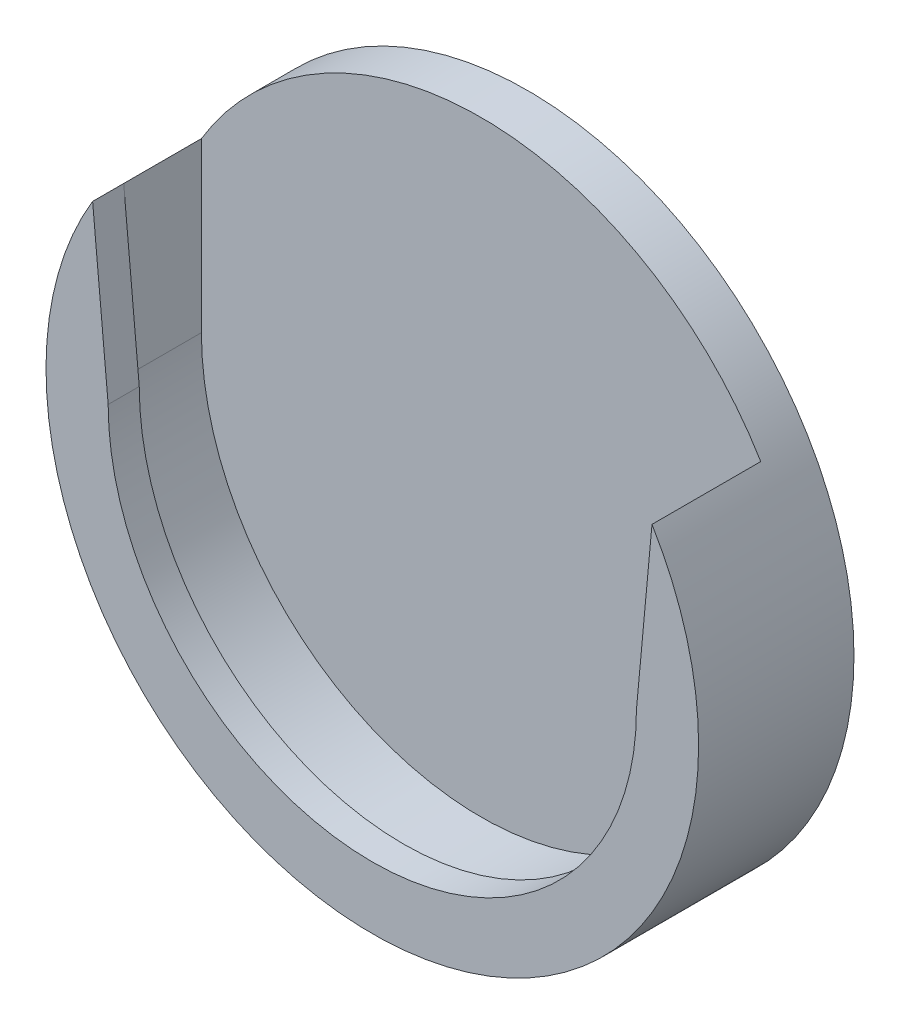
ISO-10303-21;
HEADER;
FILE_DESCRIPTION(('STEP AP214'),'2;1');
FILE_NAME('part.step','',(''),(''),'','','');
FILE_SCHEMA(('AUTOMOTIVE_DESIGN { 1 0 10303 214 1 1 1 1 }'));
ENDSEC;
DATA;
#1=APPLICATION_CONTEXT('core data for automotive mechanical design processes');
#2=APPLICATION_PROTOCOL_DEFINITION('international standard','automotive_design',2000,#1);
#3=PRODUCT_CONTEXT('',#1,'mechanical');
#4=PRODUCT('Part','Part','',(#3));
#5=PRODUCT_RELATED_PRODUCT_CATEGORY('part','',(#4));
#6=PRODUCT_DEFINITION_FORMATION('','',#4);
#7=PRODUCT_DEFINITION_CONTEXT('part definition',#1,'design');
#8=PRODUCT_DEFINITION('design','',#6,#7);
#9=PRODUCT_DEFINITION_SHAPE('','',#8);
#10=(LENGTH_UNIT() NAMED_UNIT(*) SI_UNIT(.MILLI.,.METRE.));
#11=(NAMED_UNIT(*) PLANE_ANGLE_UNIT() SI_UNIT($,.RADIAN.));
#12=(NAMED_UNIT(*) SI_UNIT($,.STERADIAN.) SOLID_ANGLE_UNIT());
#13=UNCERTAINTY_MEASURE_WITH_UNIT(LENGTH_MEASURE(1.E-05),#10,'distance_accuracy_value','');
#14=(GEOMETRIC_REPRESENTATION_CONTEXT(3) GLOBAL_UNCERTAINTY_ASSIGNED_CONTEXT((#13)) GLOBAL_UNIT_ASSIGNED_CONTEXT((#10,
#11,#12)) REPRESENTATION_CONTEXT('',''));
#15=CARTESIAN_POINT('',(0.,0.,0.));
#16=DIRECTION('',(0.,0.,1.));
#17=DIRECTION('',(1.,0.,0.));
#18=AXIS2_PLACEMENT_3D('',#15,#16,#17);
#19=CARTESIAN_POINT('',(0.,0.,-3.));
#20=DIRECTION('',(0.,0.,1.));
#21=DIRECTION('',(1.,0.,0.));
#22=AXIS2_PLACEMENT_3D('',#19,#20,#21);
#23=CYLINDRICAL_SURFACE('',#22,21.);
#24=CARTESIAN_POINT('',(0.,0.,-3.));
#25=DIRECTION('',(0.,0.,1.));
#26=DIRECTION('',(1.,0.,0.));
#27=AXIS2_PLACEMENT_3D('',#24,#25,#26);
#28=CIRCLE('',#27,21.);
#29=CARTESIAN_POINT('',(21.,0.,-3.));
#30=VERTEX_POINT('',#29);
#31=EDGE_CURVE('E11',#30,#30,#28,.T.);
#32=ORIENTED_EDGE('',*,*,#31,.T.);
#33=EDGE_LOOP('',(#32));
#34=FACE_BOUND('',#33,.T.);
#35=CARTESIAN_POINT('',(0.,0.,0.));
#36=DIRECTION('',(0.,0.,1.));
#37=DIRECTION('',(1.,0.,0.));
#38=AXIS2_PLACEMENT_3D('',#35,#36,#37);
#39=CIRCLE('',#38,21.);
#40=CARTESIAN_POINT('',(18.,10.816653826392,0.));
#41=VERTEX_POINT('',#40);
#42=CARTESIAN_POINT('',(-18.,10.816653826392,0.));
#43=VERTEX_POINT('',#42);
#44=EDGE_CURVE('E42',#41,#43,#39,.T.);
#45=ORIENTED_EDGE('',*,*,#44,.F.);
#46=DIRECTION('',(0.,0.,-1.));
#47=VECTOR('',#46,1.);
#48=CARTESIAN_POINT('',(18.,10.816653826392,5.));
#49=LINE('',#48,#47);
#50=CARTESIAN_POINT('',(18.,10.816653826392,5.));
#51=VERTEX_POINT('',#50);
#52=EDGE_CURVE('E153',#51,#41,#49,.T.);
#53=ORIENTED_EDGE('',*,*,#52,.F.);
#54=DIRECTION('',(0.,0.,-1.));
#55=VECTOR('',#54,1.);
#56=CARTESIAN_POINT('',(18.,10.816653826392,7.));
#57=LINE('',#56,#55);
#58=CARTESIAN_POINT('',(18.,10.816653826392,7.));
#59=VERTEX_POINT('',#58);
#60=EDGE_CURVE('E106',#59,#51,#57,.T.);
#61=ORIENTED_EDGE('',*,*,#60,.F.);
#62=CARTESIAN_POINT('',(0.,0.,7.));
#63=DIRECTION('',(0.,0.,1.));
#64=DIRECTION('',(1.,0.,0.));
#65=AXIS2_PLACEMENT_3D('',#62,#63,#64);
#66=CIRCLE('',#65,21.);
#67=CARTESIAN_POINT('',(-18.,10.816653826392,7.));
#68=VERTEX_POINT('',#67);
#69=EDGE_CURVE('E109',#68,#59,#66,.T.);
#70=ORIENTED_EDGE('',*,*,#69,.F.);
#71=DIRECTION('',(0.,0.,-1.));
#72=VECTOR('',#71,1.);
#73=CARTESIAN_POINT('',(-18.,10.816653826392,7.));
#74=LINE('',#73,#72);
#75=CARTESIAN_POINT('',(-18.,10.816653826392,5.));
#76=VERTEX_POINT('',#75);
#77=EDGE_CURVE('E96',#68,#76,#74,.T.);
#78=ORIENTED_EDGE('',*,*,#77,.T.);
#79=DIRECTION('',(0.,0.,-1.));
#80=VECTOR('',#79,1.);
#81=CARTESIAN_POINT('',(-18.,10.816653826392,5.));
#82=LINE('',#81,#80);
#83=EDGE_CURVE('E156',#76,#43,#82,.T.);
#84=ORIENTED_EDGE('',*,*,#83,.T.);
#85=EDGE_LOOP('',(#45,#53,#61,#70,#78,#84));
#86=FACE_BOUND('',#85,.T.);
#87=ADVANCED_FACE('F39',(#34,#86),#23,.T.);
#88=CARTESIAN_POINT('',(0.,0.,-3.));
#89=DIRECTION('',(0.,0.,1.));
#90=DIRECTION('',(1.,0.,0.));
#91=AXIS2_PLACEMENT_3D('',#88,#89,#90);
#92=PLANE('',#91);
#93=ORIENTED_EDGE('',*,*,#31,.F.);
#94=EDGE_LOOP('',(#93));
#95=FACE_BOUND('',#94,.T.);
#96=ADVANCED_FACE('F187',(#95),#92,.F.);
#97=CARTESIAN_POINT('',(0.,0.,0.));
#98=DIRECTION('',(0.,0.,1.));
#99=DIRECTION('',(1.,0.,0.));
#100=AXIS2_PLACEMENT_3D('',#97,#98,#99);
#101=PLANE('',#100);
#102=DIRECTION('',(0.,1.,0.));
#103=VECTOR('',#102,1.);
#104=CARTESIAN_POINT('',(-18.,0.,0.));
#105=LINE('',#104,#103);
#106=CARTESIAN_POINT('',(-18.,0.,0.));
#107=VERTEX_POINT('',#106);
#108=EDGE_CURVE('E53',#107,#43,#105,.T.);
#109=ORIENTED_EDGE('',*,*,#108,.F.);
#110=CARTESIAN_POINT('',(0.,0.,0.));
#111=DIRECTION('',(0.,0.,1.));
#112=DIRECTION('',(1.,0.,0.));
#113=AXIS2_PLACEMENT_3D('',#110,#111,#112);
#114=CIRCLE('',#113,18.);
#115=CARTESIAN_POINT('',(18.,0.,0.));
#116=VERTEX_POINT('',#115);
#117=EDGE_CURVE('E138',#107,#116,#114,.T.);
#118=ORIENTED_EDGE('',*,*,#117,.T.);
#119=DIRECTION('',(0.,-1.,0.));
#120=VECTOR('',#119,1.);
#121=CARTESIAN_POINT('',(18.,0.,0.));
#122=LINE('',#121,#120);
#123=EDGE_CURVE('E145',#41,#116,#122,.T.);
#124=ORIENTED_EDGE('',*,*,#123,.F.);
#125=ORIENTED_EDGE('',*,*,#44,.T.);
#126=EDGE_LOOP('',(#109,#118,#124,#125));
#127=FACE_BOUND('',#126,.T.);
#128=ADVANCED_FACE('F165',(#127),#101,.T.);
#129=CARTESIAN_POINT('',(-18.,0.,5.));
#130=DIRECTION('',(-1.,0.,0.));
#131=DIRECTION('',(0.,0.,1.));
#132=AXIS2_PLACEMENT_3D('',#129,#130,#131);
#133=PLANE('',#132);
#134=ORIENTED_EDGE('',*,*,#108,.T.);
#135=ORIENTED_EDGE('',*,*,#83,.F.);
#136=DIRECTION('',(0.,1.,0.));
#137=VECTOR('',#136,1.);
#138=CARTESIAN_POINT('',(-18.,0.,5.));
#139=LINE('',#138,#137);
#140=CARTESIAN_POINT('',(-18.,0.,5.));
#141=VERTEX_POINT('',#140);
#142=EDGE_CURVE('E135',#141,#76,#139,.T.);
#143=ORIENTED_EDGE('',*,*,#142,.F.);
#144=DIRECTION('',(0.,0.,-1.));
#145=VECTOR('',#144,1.);
#146=CARTESIAN_POINT('',(-18.,0.,5.));
#147=LINE('',#146,#145);
#148=EDGE_CURVE('E143',#141,#107,#147,.T.);
#149=ORIENTED_EDGE('',*,*,#148,.T.);
#150=EDGE_LOOP('',(#134,#135,#143,#149));
#151=FACE_BOUND('',#150,.T.);
#152=ADVANCED_FACE('F159',(#151),#133,.F.);
#153=CARTESIAN_POINT('',(18.,0.,5.));
#154=DIRECTION('',(1.,0.,0.));
#155=DIRECTION('',(0.,0.,-1.));
#156=AXIS2_PLACEMENT_3D('',#153,#154,#155);
#157=PLANE('',#156);
#158=ORIENTED_EDGE('',*,*,#123,.T.);
#159=DIRECTION('',(0.,0.,-1.));
#160=VECTOR('',#159,1.);
#161=CARTESIAN_POINT('',(18.,0.,5.));
#162=LINE('',#161,#160);
#163=CARTESIAN_POINT('',(18.,0.,5.));
#164=VERTEX_POINT('',#163);
#165=EDGE_CURVE('E150',#164,#116,#162,.T.);
#166=ORIENTED_EDGE('',*,*,#165,.F.);
#167=DIRECTION('',(0.,-1.,0.));
#168=VECTOR('',#167,1.);
#169=CARTESIAN_POINT('',(18.,0.,5.));
#170=LINE('',#169,#168);
#171=EDGE_CURVE('E137',#51,#164,#170,.T.);
#172=ORIENTED_EDGE('',*,*,#171,.F.);
#173=ORIENTED_EDGE('',*,*,#52,.T.);
#174=EDGE_LOOP('',(#158,#166,#172,#173));
#175=FACE_BOUND('',#174,.T.);
#176=ADVANCED_FACE('F167',(#175),#157,.F.);
#177=CARTESIAN_POINT('',(0.,0.,5.));
#178=DIRECTION('',(0.,0.,-1.));
#179=DIRECTION('',(-1.,0.,0.));
#180=AXIS2_PLACEMENT_3D('',#177,#178,#179);
#181=CYLINDRICAL_SURFACE('',#180,18.);
#182=ORIENTED_EDGE('',*,*,#117,.F.);
#183=ORIENTED_EDGE('',*,*,#148,.F.);
#184=CARTESIAN_POINT('',(0.,0.,5.));
#185=DIRECTION('',(0.,0.,1.));
#186=DIRECTION('',(1.,0.,0.));
#187=AXIS2_PLACEMENT_3D('',#184,#185,#186);
#188=CIRCLE('',#187,18.);
#189=EDGE_CURVE('E140',#141,#164,#188,.T.);
#190=ORIENTED_EDGE('',*,*,#189,.T.);
#191=ORIENTED_EDGE('',*,*,#165,.T.);
#192=EDGE_LOOP('',(#182,#183,#190,#191));
#193=FACE_BOUND('',#192,.T.);
#194=ADVANCED_FACE('F163',(#193),#181,.F.);
#195=CARTESIAN_POINT('',(0.,0.,5.));
#196=DIRECTION('',(0.,0.,1.));
#197=DIRECTION('',(1.,0.,0.));
#198=AXIS2_PLACEMENT_3D('',#195,#196,#197);
#199=PLANE('',#198);
#200=ORIENTED_EDGE('',*,*,#189,.F.);
#201=ORIENTED_EDGE('',*,*,#142,.T.);
#202=DIRECTION('',(0.0920574617898321,-0.995753696316922,0.));
#203=VECTOR('',#202,1.);
#204=CARTESIAN_POINT('',(-16.8559322033898,-1.55833148346325,5.));
#205=LINE('',#204,#203);
#206=CARTESIAN_POINT('',(-17.,0.,5.));
#207=VERTEX_POINT('',#206);
#208=EDGE_CURVE('E103',#76,#207,#205,.T.);
#209=ORIENTED_EDGE('',*,*,#208,.T.);
#210=CARTESIAN_POINT('',(0.,0.,5.));
#211=DIRECTION('',(0.,0.,1.));
#212=DIRECTION('',(1.,0.,0.));
#213=AXIS2_PLACEMENT_3D('',#210,#211,#212);
#214=CIRCLE('',#213,17.);
#215=CARTESIAN_POINT('',(17.,0.,5.));
#216=VERTEX_POINT('',#215);
#217=EDGE_CURVE('E119',#207,#216,#214,.T.);
#218=ORIENTED_EDGE('',*,*,#217,.T.);
#219=DIRECTION('',(0.0920574617898321,0.995753696316922,0.));
#220=VECTOR('',#219,1.);
#221=CARTESIAN_POINT('',(16.8559322033898,-1.55833148346325,5.));
#222=LINE('',#221,#220);
#223=EDGE_CURVE('E122',#216,#51,#222,.T.);
#224=ORIENTED_EDGE('',*,*,#223,.T.);
#225=ORIENTED_EDGE('',*,*,#171,.T.);
#226=EDGE_LOOP('',(#200,#201,#209,#218,#224,#225));
#227=FACE_BOUND('',#226,.T.);
#228=ADVANCED_FACE('F170',(#227),#199,.F.);
#229=CARTESIAN_POINT('',(-16.8559322033898,-1.55833148346325,7.));
#230=DIRECTION('',(0.995753696316922,0.0920574617898321,0.));
#231=DIRECTION('',(-0.0920574617898321,0.995753696316922,0.));
#232=AXIS2_PLACEMENT_3D('',#229,#230,#231);
#233=PLANE('',#232);
#234=ORIENTED_EDGE('',*,*,#208,.F.);
#235=ORIENTED_EDGE('',*,*,#77,.F.);
#236=DIRECTION('',(0.0920574617898321,-0.995753696316922,0.));
#237=VECTOR('',#236,1.);
#238=CARTESIAN_POINT('',(-16.8559322033898,-1.55833148346325,7.));
#239=LINE('',#238,#237);
#240=CARTESIAN_POINT('',(-17.,0.,7.));
#241=VERTEX_POINT('',#240);
#242=EDGE_CURVE('E100',#68,#241,#239,.T.);
#243=ORIENTED_EDGE('',*,*,#242,.T.);
#244=DIRECTION('',(0.,0.,-1.));
#245=VECTOR('',#244,1.);
#246=CARTESIAN_POINT('',(-17.,0.,7.));
#247=LINE('',#246,#245);
#248=EDGE_CURVE('E127',#241,#207,#247,.T.);
#249=ORIENTED_EDGE('',*,*,#248,.T.);
#250=EDGE_LOOP('',(#234,#235,#243,#249));
#251=FACE_BOUND('',#250,.T.);
#252=ADVANCED_FACE('F98',(#251),#233,.T.);
#253=CARTESIAN_POINT('',(16.8559322033898,-1.55833148346325,7.));
#254=DIRECTION('',(-0.995753696316922,0.0920574617898321,0.));
#255=DIRECTION('',(-0.0920574617898321,-0.995753696316922,0.));
#256=AXIS2_PLACEMENT_3D('',#253,#254,#255);
#257=PLANE('',#256);
#258=ORIENTED_EDGE('',*,*,#223,.F.);
#259=DIRECTION('',(0.,0.,-1.));
#260=VECTOR('',#259,1.);
#261=CARTESIAN_POINT('',(17.,0.,7.));
#262=LINE('',#261,#260);
#263=CARTESIAN_POINT('',(17.,0.,7.));
#264=VERTEX_POINT('',#263);
#265=EDGE_CURVE('E132',#264,#216,#262,.T.);
#266=ORIENTED_EDGE('',*,*,#265,.F.);
#267=DIRECTION('',(0.0920574617898321,0.995753696316922,0.));
#268=VECTOR('',#267,1.);
#269=CARTESIAN_POINT('',(16.8559322033898,-1.55833148346325,7.));
#270=LINE('',#269,#268);
#271=EDGE_CURVE('E114',#264,#59,#270,.T.);
#272=ORIENTED_EDGE('',*,*,#271,.T.);
#273=ORIENTED_EDGE('',*,*,#60,.T.);
#274=EDGE_LOOP('',(#258,#266,#272,#273));
#275=FACE_BOUND('',#274,.T.);
#276=ADVANCED_FACE('F174',(#275),#257,.T.);
#277=CARTESIAN_POINT('',(0.,0.,7.));
#278=DIRECTION('',(0.,0.,-1.));
#279=DIRECTION('',(-1.,0.,0.));
#280=AXIS2_PLACEMENT_3D('',#277,#278,#279);
#281=CYLINDRICAL_SURFACE('',#280,17.);
#282=ORIENTED_EDGE('',*,*,#217,.F.);
#283=ORIENTED_EDGE('',*,*,#248,.F.);
#284=CARTESIAN_POINT('',(0.,0.,7.));
#285=DIRECTION('',(0.,0.,1.));
#286=DIRECTION('',(1.,0.,0.));
#287=AXIS2_PLACEMENT_3D('',#284,#285,#286);
#288=CIRCLE('',#287,17.);
#289=EDGE_CURVE('E118',#241,#264,#288,.T.);
#290=ORIENTED_EDGE('',*,*,#289,.T.);
#291=ORIENTED_EDGE('',*,*,#265,.T.);
#292=EDGE_LOOP('',(#282,#283,#290,#291));
#293=FACE_BOUND('',#292,.T.);
#294=ADVANCED_FACE('F176',(#293),#281,.F.);
#295=CARTESIAN_POINT('',(0.,0.,7.));
#296=DIRECTION('',(0.,0.,1.));
#297=DIRECTION('',(1.,0.,0.));
#298=AXIS2_PLACEMENT_3D('',#295,#296,#297);
#299=PLANE('',#298);
#300=ORIENTED_EDGE('',*,*,#242,.F.);
#301=ORIENTED_EDGE('',*,*,#69,.T.);
#302=ORIENTED_EDGE('',*,*,#271,.F.);
#303=ORIENTED_EDGE('',*,*,#289,.F.);
#304=EDGE_LOOP('',(#300,#301,#302,#303));
#305=FACE_BOUND('',#304,.T.);
#306=ADVANCED_FACE('F116',(#305),#299,.T.);
#307=CLOSED_SHELL('',(#87,#96,#128,#152,#176,#194,#228,#252,#276,#294,#306));
#308=MANIFOLD_SOLID_BREP('B2',#307);
#309=ADVANCED_BREP_SHAPE_REPRESENTATION('',(#18,#308),#14);
#310=SHAPE_DEFINITION_REPRESENTATION(#9,#309);
ENDSEC;
END-ISO-10303-21;
